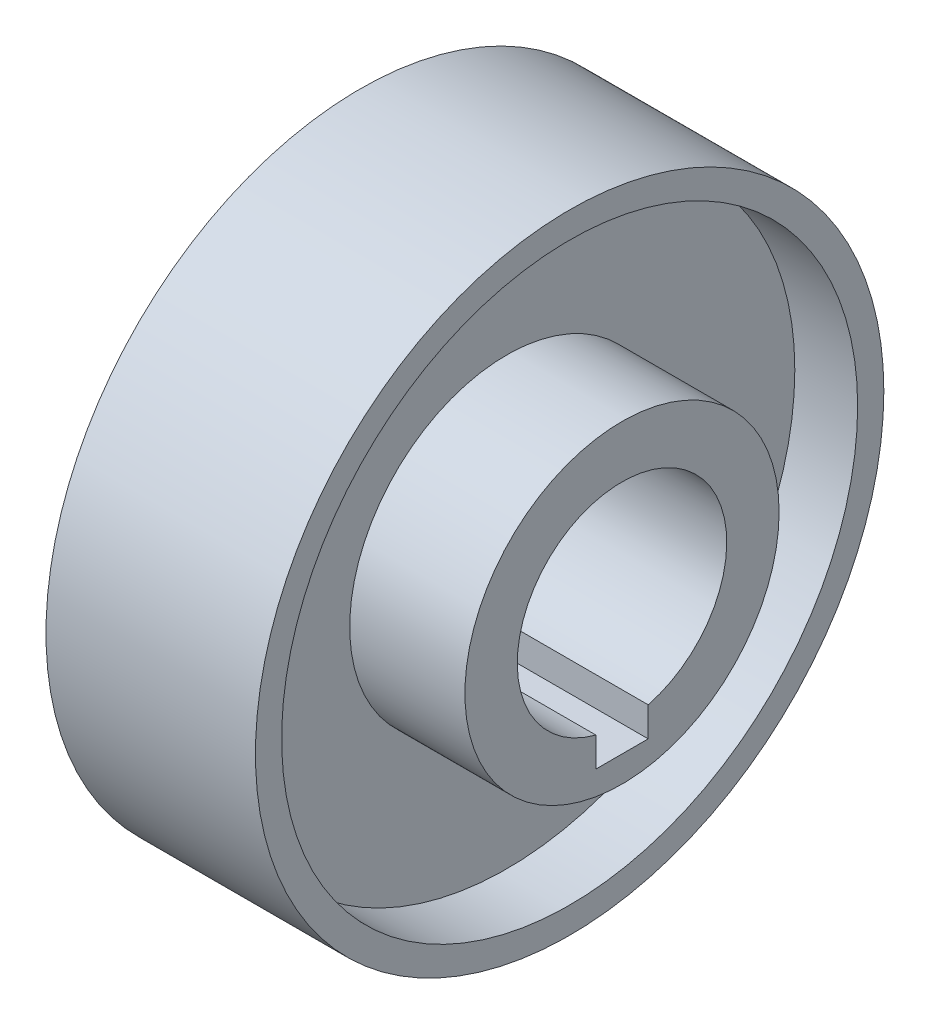
ISO-10303-21;
HEADER;
FILE_DESCRIPTION(('STEP AP214'),'2;1');
FILE_NAME('part.step','',(''),(''),'','','');
FILE_SCHEMA(('AUTOMOTIVE_DESIGN { 1 0 10303 214 1 1 1 1 }'));
ENDSEC;
DATA;
#1=APPLICATION_CONTEXT('core data for automotive mechanical design processes');
#2=APPLICATION_PROTOCOL_DEFINITION('international standard','automotive_design',2000,#1);
#3=PRODUCT_CONTEXT('',#1,'mechanical');
#4=PRODUCT('Part','Part','',(#3));
#5=PRODUCT_RELATED_PRODUCT_CATEGORY('part','',(#4));
#6=PRODUCT_DEFINITION_FORMATION('','',#4);
#7=PRODUCT_DEFINITION_CONTEXT('part definition',#1,'design');
#8=PRODUCT_DEFINITION('design','',#6,#7);
#9=PRODUCT_DEFINITION_SHAPE('','',#8);
#10=(LENGTH_UNIT() NAMED_UNIT(*) SI_UNIT(.MILLI.,.METRE.));
#11=(NAMED_UNIT(*) PLANE_ANGLE_UNIT() SI_UNIT($,.RADIAN.));
#12=(NAMED_UNIT(*) SI_UNIT($,.STERADIAN.) SOLID_ANGLE_UNIT());
#13=UNCERTAINTY_MEASURE_WITH_UNIT(LENGTH_MEASURE(1.E-05),#10,'distance_accuracy_value','');
#14=(GEOMETRIC_REPRESENTATION_CONTEXT(3) GLOBAL_UNCERTAINTY_ASSIGNED_CONTEXT((#13)) GLOBAL_UNIT_ASSIGNED_CONTEXT((#10,
#11,#12)) REPRESENTATION_CONTEXT('',''));
#15=CARTESIAN_POINT('',(0.,0.,0.));
#16=DIRECTION('',(0.,0.,1.));
#17=DIRECTION('',(1.,0.,0.));
#18=AXIS2_PLACEMENT_3D('',#15,#16,#17);
#19=CARTESIAN_POINT('',(150.,0.,0.));
#20=DIRECTION('',(-1.,0.,0.));
#21=DIRECTION('',(0.,0.,1.));
#22=AXIS2_PLACEMENT_3D('',#19,#20,#21);
#23=CYLINDRICAL_SURFACE('',#22,150.);
#24=CARTESIAN_POINT('',(-150.,0.,0.));
#25=DIRECTION('',(1.,0.,0.));
#26=DIRECTION('',(0.,0.,-1.));
#27=AXIS2_PLACEMENT_3D('',#24,#25,#26);
#28=CIRCLE('',#27,150.);
#29=CARTESIAN_POINT('',(-150.,0.,-150.));
#30=VERTEX_POINT('',#29);
#31=EDGE_CURVE('E99',#30,#30,#28,.T.);
#32=ORIENTED_EDGE('',*,*,#31,.T.);
#33=EDGE_LOOP('',(#32));
#34=FACE_BOUND('',#33,.T.);
#35=CARTESIAN_POINT('',(-40.,0.,0.));
#36=DIRECTION('',(1.,0.,0.));
#37=DIRECTION('',(0.,0.,-1.));
#38=AXIS2_PLACEMENT_3D('',#35,#36,#37);
#39=CIRCLE('',#38,150.);
#40=CARTESIAN_POINT('',(-40.,0.,-150.));
#41=VERTEX_POINT('',#40);
#42=EDGE_CURVE('E11',#41,#41,#39,.T.);
#43=ORIENTED_EDGE('',*,*,#42,.F.);
#44=EDGE_LOOP('',(#43));
#45=FACE_BOUND('',#44,.T.);
#46=ADVANCED_FACE('F39',(#34,#45),#23,.T.);
#47=CARTESIAN_POINT('',(150.,0.,0.));
#48=DIRECTION('',(1.,0.,0.));
#49=DIRECTION('',(0.,0.,-1.));
#50=AXIS2_PLACEMENT_3D('',#47,#48,#49);
#51=PLANE('',#50);
#52=CARTESIAN_POINT('',(150.,0.,0.));
#53=DIRECTION('',(1.,0.,0.));
#54=DIRECTION('',(0.,0.,-1.));
#55=AXIS2_PLACEMENT_3D('',#52,#53,#54);
#56=CIRCLE('',#55,150.);
#57=CARTESIAN_POINT('',(150.,0.,-150.));
#58=VERTEX_POINT('',#57);
#59=EDGE_CURVE('E48',#58,#58,#56,.T.);
#60=ORIENTED_EDGE('',*,*,#59,.T.);
#61=EDGE_LOOP('',(#60));
#62=FACE_BOUND('',#61,.T.);
#63=DIRECTION('',(0.,0.,-1.));
#64=VECTOR('',#63,1.);
#65=CARTESIAN_POINT('',(150.,-125.,25.));
#66=LINE('',#65,#64);
#67=CARTESIAN_POINT('',(150.,-125.,25.));
#68=VERTEX_POINT('',#67);
#69=CARTESIAN_POINT('',(150.,-125.,-25.));
#70=VERTEX_POINT('',#69);
#71=EDGE_CURVE('E90',#68,#70,#66,.T.);
#72=ORIENTED_EDGE('',*,*,#71,.F.);
#73=DIRECTION('',(0.,-1.,0.));
#74=VECTOR('',#73,1.);
#75=CARTESIAN_POINT('',(150.,-125.,25.));
#76=LINE('',#75,#74);
#77=CARTESIAN_POINT('',(150.,-96.8245836551854,25.0000000000001));
#78=VERTEX_POINT('',#77);
#79=EDGE_CURVE('E81',#78,#68,#76,.T.);
#80=ORIENTED_EDGE('',*,*,#79,.F.);
#81=CARTESIAN_POINT('',(150.,0.,0.));
#82=DIRECTION('',(1.,0.,0.));
#83=DIRECTION('',(0.,0.,-1.));
#84=AXIS2_PLACEMENT_3D('',#81,#82,#83);
#85=CIRCLE('',#84,100.);
#86=CARTESIAN_POINT('',(150.,-96.8245836551854,-25.));
#87=VERTEX_POINT('',#86);
#88=EDGE_CURVE('E108',#87,#78,#85,.T.);
#89=ORIENTED_EDGE('',*,*,#88,.F.);
#90=DIRECTION('',(0.,1.,0.));
#91=VECTOR('',#90,1.);
#92=CARTESIAN_POINT('',(150.,-125.,-25.));
#93=LINE('',#92,#91);
#94=EDGE_CURVE('E104',#70,#87,#93,.T.);
#95=ORIENTED_EDGE('',*,*,#94,.F.);
#96=EDGE_LOOP('',(#72,#80,#89,#95));
#97=FACE_BOUND('',#96,.T.);
#98=ADVANCED_FACE('F103',(#62,#97),#51,.T.);
#99=CARTESIAN_POINT('',(-150.,0.,0.));
#100=DIRECTION('',(1.,0.,0.));
#101=DIRECTION('',(0.,0.,-1.));
#102=AXIS2_PLACEMENT_3D('',#99,#100,#101);
#103=PLANE('',#102);
#104=ORIENTED_EDGE('',*,*,#31,.F.);
#105=EDGE_LOOP('',(#104));
#106=FACE_BOUND('',#105,.T.);
#107=DIRECTION('',(0.,-1.,0.));
#108=VECTOR('',#107,1.);
#109=CARTESIAN_POINT('',(-150.,-125.,25.));
#110=LINE('',#109,#108);
#111=CARTESIAN_POINT('',(-150.,-96.8245836551854,25.0000000000001));
#112=VERTEX_POINT('',#111);
#113=CARTESIAN_POINT('',(-150.,-125.,25.));
#114=VERTEX_POINT('',#113);
#115=EDGE_CURVE('E63',#112,#114,#110,.T.);
#116=ORIENTED_EDGE('',*,*,#115,.T.);
#117=DIRECTION('',(0.,0.,-1.));
#118=VECTOR('',#117,1.);
#119=CARTESIAN_POINT('',(-150.,-125.,25.));
#120=LINE('',#119,#118);
#121=CARTESIAN_POINT('',(-150.,-125.,-25.));
#122=VERTEX_POINT('',#121);
#123=EDGE_CURVE('E97',#114,#122,#120,.T.);
#124=ORIENTED_EDGE('',*,*,#123,.T.);
#125=DIRECTION('',(0.,1.,0.));
#126=VECTOR('',#125,1.);
#127=CARTESIAN_POINT('',(-150.,-125.,-25.));
#128=LINE('',#127,#126);
#129=CARTESIAN_POINT('',(-150.,-96.8245836551854,-25.));
#130=VERTEX_POINT('',#129);
#131=EDGE_CURVE('E119',#122,#130,#128,.T.);
#132=ORIENTED_EDGE('',*,*,#131,.T.);
#133=CARTESIAN_POINT('',(-150.,0.,0.));
#134=DIRECTION('',(1.,0.,0.));
#135=DIRECTION('',(0.,0.,-1.));
#136=AXIS2_PLACEMENT_3D('',#133,#134,#135);
#137=CIRCLE('',#136,100.);
#138=EDGE_CURVE('E91',#130,#112,#137,.T.);
#139=ORIENTED_EDGE('',*,*,#138,.T.);
#140=EDGE_LOOP('',(#116,#124,#132,#139));
#141=FACE_BOUND('',#140,.T.);
#142=ADVANCED_FACE('F140',(#106,#141),#103,.F.);
#143=CARTESIAN_POINT('',(40.,0.,0.));
#144=DIRECTION('',(1.,0.,0.));
#145=DIRECTION('',(0.,0.,-1.));
#146=AXIS2_PLACEMENT_3D('',#143,#144,#145);
#147=CIRCLE('',#146,150.);
#148=CARTESIAN_POINT('',(40.,0.,-150.));
#149=VERTEX_POINT('',#148);
#150=EDGE_CURVE('E174',#149,#149,#147,.T.);
#151=ORIENTED_EDGE('',*,*,#150,.T.);
#152=EDGE_LOOP('',(#151));
#153=FACE_BOUND('',#152,.T.);
#154=ORIENTED_EDGE('',*,*,#59,.F.);
#155=EDGE_LOOP('',(#154));
#156=FACE_BOUND('',#155,.T.);
#157=ADVANCED_FACE('F41',(#153,#156),#23,.T.);
#158=CARTESIAN_POINT('',(150.,-125.,25.));
#159=DIRECTION('',(0.,0.,-1.));
#160=DIRECTION('',(0.,1.,0.));
#161=AXIS2_PLACEMENT_3D('',#158,#159,#160);
#162=PLANE('',#161);
#163=ORIENTED_EDGE('',*,*,#115,.F.);
#164=DIRECTION('',(-1.,0.,0.));
#165=VECTOR('',#164,1.);
#166=CARTESIAN_POINT('',(150.,-96.8245836551854,25.0000000000001));
#167=LINE('',#166,#165);
#168=EDGE_CURVE('E85',#78,#112,#167,.T.);
#169=ORIENTED_EDGE('',*,*,#168,.F.);
#170=ORIENTED_EDGE('',*,*,#79,.T.);
#171=DIRECTION('',(-1.,0.,0.));
#172=VECTOR('',#171,1.);
#173=CARTESIAN_POINT('',(150.,-125.,25.));
#174=LINE('',#173,#172);
#175=EDGE_CURVE('E84',#68,#114,#174,.T.);
#176=ORIENTED_EDGE('',*,*,#175,.T.);
#177=EDGE_LOOP('',(#163,#169,#170,#176));
#178=FACE_BOUND('',#177,.T.);
#179=ADVANCED_FACE('F83',(#178),#162,.T.);
#180=CARTESIAN_POINT('',(150.,-125.,25.));
#181=DIRECTION('',(0.,1.,0.));
#182=DIRECTION('',(0.,0.,1.));
#183=AXIS2_PLACEMENT_3D('',#180,#181,#182);
#184=PLANE('',#183);
#185=ORIENTED_EDGE('',*,*,#123,.F.);
#186=ORIENTED_EDGE('',*,*,#175,.F.);
#187=ORIENTED_EDGE('',*,*,#71,.T.);
#188=DIRECTION('',(-1.,0.,0.));
#189=VECTOR('',#188,1.);
#190=CARTESIAN_POINT('',(150.,-125.,-25.));
#191=LINE('',#190,#189);
#192=EDGE_CURVE('E100',#70,#122,#191,.T.);
#193=ORIENTED_EDGE('',*,*,#192,.T.);
#194=EDGE_LOOP('',(#185,#186,#187,#193));
#195=FACE_BOUND('',#194,.T.);
#196=ADVANCED_FACE('F94',(#195),#184,.T.);
#197=CARTESIAN_POINT('',(150.,-125.,-25.));
#198=DIRECTION('',(0.,0.,1.));
#199=DIRECTION('',(1.,0.,0.));
#200=AXIS2_PLACEMENT_3D('',#197,#198,#199);
#201=PLANE('',#200);
#202=ORIENTED_EDGE('',*,*,#131,.F.);
#203=ORIENTED_EDGE('',*,*,#192,.F.);
#204=ORIENTED_EDGE('',*,*,#94,.T.);
#205=DIRECTION('',(-1.,0.,0.));
#206=VECTOR('',#205,1.);
#207=CARTESIAN_POINT('',(150.,-96.8245836551854,-25.));
#208=LINE('',#207,#206);
#209=EDGE_CURVE('E55',#87,#130,#208,.T.);
#210=ORIENTED_EDGE('',*,*,#209,.T.);
#211=EDGE_LOOP('',(#202,#203,#204,#210));
#212=FACE_BOUND('',#211,.T.);
#213=ADVANCED_FACE('F147',(#212),#201,.T.);
#214=CARTESIAN_POINT('',(150.,0.,0.));
#215=DIRECTION('',(-1.,0.,0.));
#216=DIRECTION('',(0.,0.,1.));
#217=AXIS2_PLACEMENT_3D('',#214,#215,#216);
#218=CYLINDRICAL_SURFACE('',#217,100.);
#219=ORIENTED_EDGE('',*,*,#138,.F.);
#220=ORIENTED_EDGE('',*,*,#209,.F.);
#221=ORIENTED_EDGE('',*,*,#88,.T.);
#222=ORIENTED_EDGE('',*,*,#168,.T.);
#223=EDGE_LOOP('',(#219,#220,#221,#222));
#224=FACE_BOUND('',#223,.T.);
#225=ADVANCED_FACE('F144',(#224),#218,.F.);
#226=CARTESIAN_POINT('',(40.,0.,0.));
#227=DIRECTION('',(1.,0.,0.));
#228=DIRECTION('',(0.,0.,-1.));
#229=AXIS2_PLACEMENT_3D('',#226,#227,#228);
#230=PLANE('',#229);
#231=CARTESIAN_POINT('',(40.,0.,0.));
#232=DIRECTION('',(1.,0.,0.));
#233=DIRECTION('',(0.,0.,-1.));
#234=AXIS2_PLACEMENT_3D('',#231,#232,#233);
#235=CIRCLE('',#234,275.);
#236=CARTESIAN_POINT('',(40.,0.,-275.));
#237=VERTEX_POINT('',#236);
#238=EDGE_CURVE('E178',#237,#237,#235,.F.);
#239=ORIENTED_EDGE('',*,*,#238,.F.);
#240=EDGE_LOOP('',(#239));
#241=FACE_BOUND('',#240,.T.);
#242=ORIENTED_EDGE('',*,*,#150,.F.);
#243=EDGE_LOOP('',(#242));
#244=FACE_BOUND('',#243,.T.);
#245=ADVANCED_FACE('F146',(#241,#244),#230,.T.);
#246=CARTESIAN_POINT('',(-40.,0.,0.));
#247=DIRECTION('',(1.,0.,0.));
#248=DIRECTION('',(0.,0.,-1.));
#249=AXIS2_PLACEMENT_3D('',#246,#247,#248);
#250=PLANE('',#249);
#251=CARTESIAN_POINT('',(-40.,0.,0.));
#252=DIRECTION('',(1.,0.,0.));
#253=DIRECTION('',(0.,0.,-1.));
#254=AXIS2_PLACEMENT_3D('',#251,#252,#253);
#255=CIRCLE('',#254,275.);
#256=CARTESIAN_POINT('',(-40.,0.,-275.));
#257=VERTEX_POINT('',#256);
#258=EDGE_CURVE('E116',#257,#257,#255,.T.);
#259=ORIENTED_EDGE('',*,*,#258,.F.);
#260=EDGE_LOOP('',(#259));
#261=FACE_BOUND('',#260,.T.);
#262=ORIENTED_EDGE('',*,*,#42,.T.);
#263=EDGE_LOOP('',(#262));
#264=FACE_BOUND('',#263,.T.);
#265=ADVANCED_FACE('F153',(#261,#264),#250,.F.);
#266=CARTESIAN_POINT('',(100.,0.,0.));
#267=DIRECTION('',(-1.,0.,0.));
#268=DIRECTION('',(0.,0.,1.));
#269=AXIS2_PLACEMENT_3D('',#266,#267,#268);
#270=CYLINDRICAL_SURFACE('',#269,275.);
#271=CARTESIAN_POINT('',(-100.,0.,0.));
#272=DIRECTION('',(1.,0.,0.));
#273=DIRECTION('',(0.,0.,-1.));
#274=AXIS2_PLACEMENT_3D('',#271,#272,#273);
#275=CIRCLE('',#274,275.);
#276=CARTESIAN_POINT('',(-100.,0.,-275.));
#277=VERTEX_POINT('',#276);
#278=EDGE_CURVE('E195',#277,#277,#275,.T.);
#279=ORIENTED_EDGE('',*,*,#278,.F.);
#280=EDGE_LOOP('',(#279));
#281=FACE_BOUND('',#280,.T.);
#282=ORIENTED_EDGE('',*,*,#258,.T.);
#283=EDGE_LOOP('',(#282));
#284=FACE_BOUND('',#283,.T.);
#285=ADVANCED_FACE('F208',(#281,#284),#270,.F.);
#286=CARTESIAN_POINT('',(100.,0.,0.));
#287=DIRECTION('',(1.,0.,0.));
#288=DIRECTION('',(0.,0.,-1.));
#289=AXIS2_PLACEMENT_3D('',#286,#287,#288);
#290=PLANE('',#289);
#291=CARTESIAN_POINT('',(100.,0.,0.));
#292=DIRECTION('',(1.,0.,0.));
#293=DIRECTION('',(0.,0.,-1.));
#294=AXIS2_PLACEMENT_3D('',#291,#292,#293);
#295=CIRCLE('',#294,300.);
#296=CARTESIAN_POINT('',(100.,0.,-300.));
#297=VERTEX_POINT('',#296);
#298=EDGE_CURVE('E184',#297,#297,#295,.T.);
#299=ORIENTED_EDGE('',*,*,#298,.T.);
#300=EDGE_LOOP('',(#299));
#301=FACE_BOUND('',#300,.T.);
#302=CARTESIAN_POINT('',(100.,0.,0.));
#303=DIRECTION('',(1.,0.,0.));
#304=DIRECTION('',(0.,0.,-1.));
#305=AXIS2_PLACEMENT_3D('',#302,#303,#304);
#306=CIRCLE('',#305,275.);
#307=CARTESIAN_POINT('',(100.,0.,-275.));
#308=VERTEX_POINT('',#307);
#309=EDGE_CURVE('E191',#308,#308,#306,.T.);
#310=ORIENTED_EDGE('',*,*,#309,.F.);
#311=EDGE_LOOP('',(#310));
#312=FACE_BOUND('',#311,.T.);
#313=ADVANCED_FACE('F205',(#301,#312),#290,.T.);
#314=CARTESIAN_POINT('',(-100.,0.,0.));
#315=DIRECTION('',(1.,0.,0.));
#316=DIRECTION('',(0.,0.,-1.));
#317=AXIS2_PLACEMENT_3D('',#314,#315,#316);
#318=PLANE('',#317);
#319=CARTESIAN_POINT('',(-100.,0.,0.));
#320=DIRECTION('',(1.,0.,0.));
#321=DIRECTION('',(0.,0.,-1.));
#322=AXIS2_PLACEMENT_3D('',#319,#320,#321);
#323=CIRCLE('',#322,300.);
#324=CARTESIAN_POINT('',(-100.,0.,-300.));
#325=VERTEX_POINT('',#324);
#326=EDGE_CURVE('E187',#325,#325,#323,.T.);
#327=ORIENTED_EDGE('',*,*,#326,.F.);
#328=EDGE_LOOP('',(#327));
#329=FACE_BOUND('',#328,.T.);
#330=ORIENTED_EDGE('',*,*,#278,.T.);
#331=EDGE_LOOP('',(#330));
#332=FACE_BOUND('',#331,.T.);
#333=ADVANCED_FACE('F207',(#329,#332),#318,.F.);
#334=CARTESIAN_POINT('',(100.,0.,0.));
#335=DIRECTION('',(-1.,0.,0.));
#336=DIRECTION('',(0.,0.,1.));
#337=AXIS2_PLACEMENT_3D('',#334,#335,#336);
#338=CYLINDRICAL_SURFACE('',#337,300.);
#339=ORIENTED_EDGE('',*,*,#298,.F.);
#340=EDGE_LOOP('',(#339));
#341=FACE_BOUND('',#340,.T.);
#342=ORIENTED_EDGE('',*,*,#326,.T.);
#343=EDGE_LOOP('',(#342));
#344=FACE_BOUND('',#343,.T.);
#345=ADVANCED_FACE('F215',(#341,#344),#338,.T.);
#346=ORIENTED_EDGE('',*,*,#238,.T.);
#347=EDGE_LOOP('',(#346));
#348=FACE_BOUND('',#347,.T.);
#349=ORIENTED_EDGE('',*,*,#309,.T.);
#350=EDGE_LOOP('',(#349));
#351=FACE_BOUND('',#350,.T.);
#352=ADVANCED_FACE('F203',(#348,#351),#270,.F.);
#353=CLOSED_SHELL('',(#46,#98,#142,#157,#179,#196,#213,#225,#245,#265,#285,#313,#333,#345,#352));
#354=MANIFOLD_SOLID_BREP('B2',#353);
#355=ADVANCED_BREP_SHAPE_REPRESENTATION('',(#18,#354),#14);
#356=SHAPE_DEFINITION_REPRESENTATION(#9,#355);
ENDSEC;
END-ISO-10303-21;
